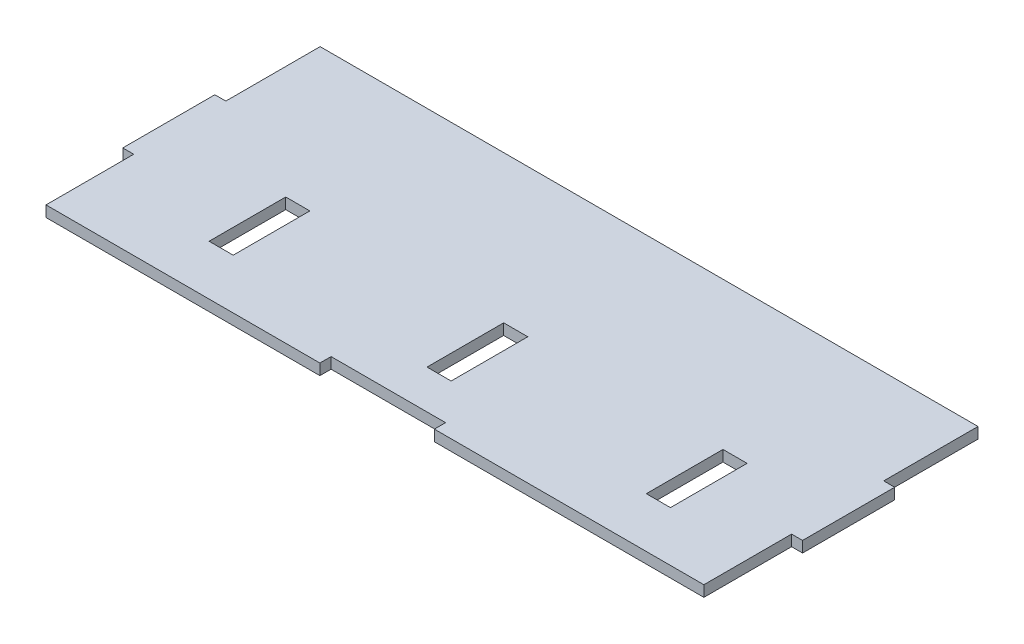
ISO-10303-21;
HEADER;
FILE_DESCRIPTION(('STEP AP214'),'2;1');
FILE_NAME('part.step','',(''),(''),'','','');
FILE_SCHEMA(('AUTOMOTIVE_DESIGN { 1 0 10303 214 1 1 1 1 }'));
ENDSEC;
DATA;
#1=APPLICATION_CONTEXT('core data for automotive mechanical design processes');
#2=APPLICATION_PROTOCOL_DEFINITION('international standard','automotive_design',2000,#1);
#3=PRODUCT_CONTEXT('',#1,'mechanical');
#4=PRODUCT('Part','Part','',(#3));
#5=PRODUCT_RELATED_PRODUCT_CATEGORY('part','',(#4));
#6=PRODUCT_DEFINITION_FORMATION('','',#4);
#7=PRODUCT_DEFINITION_CONTEXT('part definition',#1,'design');
#8=PRODUCT_DEFINITION('design','',#6,#7);
#9=PRODUCT_DEFINITION_SHAPE('','',#8);
#10=(LENGTH_UNIT() NAMED_UNIT(*) SI_UNIT(.MILLI.,.METRE.));
#11=(NAMED_UNIT(*) PLANE_ANGLE_UNIT() SI_UNIT($,.RADIAN.));
#12=(NAMED_UNIT(*) SI_UNIT($,.STERADIAN.) SOLID_ANGLE_UNIT());
#13=UNCERTAINTY_MEASURE_WITH_UNIT(LENGTH_MEASURE(1.E-05),#10,'distance_accuracy_value','');
#14=(GEOMETRIC_REPRESENTATION_CONTEXT(3) GLOBAL_UNCERTAINTY_ASSIGNED_CONTEXT((#13)) GLOBAL_UNIT_ASSIGNED_CONTEXT((#10,
#11,#12)) REPRESENTATION_CONTEXT('',''));
#15=CARTESIAN_POINT('',(0.,0.,0.));
#16=DIRECTION('',(0.,0.,1.));
#17=DIRECTION('',(1.,0.,0.));
#18=AXIS2_PLACEMENT_3D('',#15,#16,#17);
#19=CARTESIAN_POINT('',(0.,5.,125.));
#20=DIRECTION('',(0.,0.,-1.));
#21=DIRECTION('',(-1.,0.,0.));
#22=AXIS2_PLACEMENT_3D('',#19,#20,#21);
#23=PLANE('',#22);
#24=DIRECTION('',(1.,0.,0.));
#25=VECTOR('',#24,1.);
#26=CARTESIAN_POINT('',(0.,0.,125.));
#27=LINE('',#26,#25);
#28=CARTESIAN_POINT('',(-300.,0.,125.));
#29=VERTEX_POINT('',#28);
#30=CARTESIAN_POINT('',(-175.100000000002,0.,125.));
#31=VERTEX_POINT('',#30);
#32=EDGE_CURVE('E472',#29,#31,#27,.T.);
#33=ORIENTED_EDGE('',*,*,#32,.T.);
#34=DIRECTION('',(0.,1.,0.));
#35=VECTOR('',#34,1.);
#36=CARTESIAN_POINT('',(-175.100000000002,5.,125.));
#37=LINE('',#36,#35);
#38=CARTESIAN_POINT('',(-175.100000000002,5.,125.));
#39=VERTEX_POINT('',#38);
#40=EDGE_CURVE('E372',#31,#39,#37,.T.);
#41=ORIENTED_EDGE('',*,*,#40,.T.);
#42=DIRECTION('',(1.,0.,0.));
#43=VECTOR('',#42,1.);
#44=CARTESIAN_POINT('',(0.,5.,125.));
#45=LINE('',#44,#43);
#46=CARTESIAN_POINT('',(-300.,5.,125.));
#47=VERTEX_POINT('',#46);
#48=EDGE_CURVE('E459',#47,#39,#45,.T.);
#49=ORIENTED_EDGE('',*,*,#48,.F.);
#50=DIRECTION('',(0.,-1.,0.));
#51=VECTOR('',#50,1.);
#52=CARTESIAN_POINT('',(-300.,5.,125.));
#53=LINE('',#52,#51);
#54=EDGE_CURVE('E477',#47,#29,#53,.T.);
#55=ORIENTED_EDGE('',*,*,#54,.T.);
#56=EDGE_LOOP('',(#33,#41,#49,#55));
#57=FACE_BOUND('',#56,.T.);
#58=ADVANCED_FACE('F89',(#57),#23,.F.);
#59=CARTESIAN_POINT('',(0.,5.,0.));
#60=DIRECTION('',(-1.,0.,0.));
#61=DIRECTION('',(0.,0.,1.));
#62=AXIS2_PLACEMENT_3D('',#59,#60,#61);
#63=PLANE('',#62);
#64=CARTESIAN_POINT('',(0.,5.,85.));
#65=CARTESIAN_POINT('',(0.,0.,85.));
#66=B_SPLINE_CURVE_WITH_KNOTS('',1,(#64,#65),.UNSPECIFIED.,.F.,.F.,(2,2),(0.,
0.0531914893617021),.UNSPECIFIED.);
#67=CARTESIAN_POINT('',(0.,5.,85.));
#68=VERTEX_POINT('',#67);
#69=CARTESIAN_POINT('',(0.,0.,85.));
#70=VERTEX_POINT('',#69);
#71=EDGE_CURVE('E383',#68,#70,#66,.T.);
#72=ORIENTED_EDGE('',*,*,#71,.F.);
#73=DIRECTION('',(0.,0.,-1.));
#74=VECTOR('',#73,1.);
#75=CARTESIAN_POINT('',(0.,5.,0.));
#76=LINE('',#75,#74);
#77=CARTESIAN_POINT('',(0.,5.,125.));
#78=VERTEX_POINT('',#77);
#79=EDGE_CURVE('E448',#78,#68,#76,.T.);
#80=ORIENTED_EDGE('',*,*,#79,.F.);
#81=DIRECTION('',(0.,-1.,0.));
#82=VECTOR('',#81,1.);
#83=CARTESIAN_POINT('',(0.,5.,125.));
#84=LINE('',#83,#82);
#85=CARTESIAN_POINT('',(0.,0.,125.));
#86=VERTEX_POINT('',#85);
#87=EDGE_CURVE('E462',#78,#86,#84,.T.);
#88=ORIENTED_EDGE('',*,*,#87,.T.);
#89=DIRECTION('',(0.,0.,-1.));
#90=VECTOR('',#89,1.);
#91=CARTESIAN_POINT('',(0.,0.,0.));
#92=LINE('',#91,#90);
#93=EDGE_CURVE('E463',#86,#70,#92,.T.);
#94=ORIENTED_EDGE('',*,*,#93,.T.);
#95=EDGE_LOOP('',(#72,#80,#88,#94));
#96=FACE_BOUND('',#95,.T.);
#97=ADVANCED_FACE('F91',(#96),#63,.F.);
#98=CARTESIAN_POINT('',(0.,0.,43.));
#99=CARTESIAN_POINT('',(0.,5.,43.));
#100=B_SPLINE_CURVE_WITH_KNOTS('',1,(#98,#99),.UNSPECIFIED.,.F.,.F.,(2,2),(0.5,
0.553191489361702),.UNSPECIFIED.);
#101=CARTESIAN_POINT('',(0.,0.,43.));
#102=VERTEX_POINT('',#101);
#103=CARTESIAN_POINT('',(0.,5.,43.));
#104=VERTEX_POINT('',#103);
#105=EDGE_CURVE('E376',#102,#104,#100,.T.);
#106=ORIENTED_EDGE('',*,*,#105,.F.);
#107=CARTESIAN_POINT('',(0.,0.,0.));
#108=VERTEX_POINT('',#107);
#109=EDGE_CURVE('E447',#102,#108,#92,.T.);
#110=ORIENTED_EDGE('',*,*,#109,.T.);
#111=DIRECTION('',(0.,-1.,0.));
#112=VECTOR('',#111,1.);
#113=CARTESIAN_POINT('',(0.,5.,0.));
#114=LINE('',#113,#112);
#115=CARTESIAN_POINT('',(0.,5.,0.));
#116=VERTEX_POINT('',#115);
#117=EDGE_CURVE('E483',#116,#108,#114,.T.);
#118=ORIENTED_EDGE('',*,*,#117,.F.);
#119=EDGE_CURVE('E452',#104,#116,#76,.T.);
#120=ORIENTED_EDGE('',*,*,#119,.F.);
#121=EDGE_LOOP('',(#106,#110,#118,#120));
#122=FACE_BOUND('',#121,.T.);
#123=ADVANCED_FACE('F538',(#122),#63,.F.);
#124=CARTESIAN_POINT('',(-300.,5.,0.));
#125=DIRECTION('',(1.,0.,0.));
#126=DIRECTION('',(0.,0.,-1.));
#127=AXIS2_PLACEMENT_3D('',#124,#125,#126);
#128=PLANE('',#127);
#129=DIRECTION('',(0.,0.,1.));
#130=VECTOR('',#129,1.);
#131=CARTESIAN_POINT('',(-300.,5.,0.));
#132=LINE('',#131,#130);
#133=CARTESIAN_POINT('',(-300.,5.,85.));
#134=VERTEX_POINT('',#133);
#135=EDGE_CURVE('E454',#134,#47,#132,.T.);
#136=ORIENTED_EDGE('',*,*,#135,.F.);
#137=CARTESIAN_POINT('',(-300.,5.,85.));
#138=CARTESIAN_POINT('',(-300.,0.,85.));
#139=B_SPLINE_CURVE_WITH_KNOTS('',1,(#137,#138),.UNSPECIFIED.,.F.,.F.,(2,2),(0.,
0.0531914893617021),.UNSPECIFIED.);
#140=CARTESIAN_POINT('',(-300.,0.,85.));
#141=VERTEX_POINT('',#140);
#142=EDGE_CURVE('E398',#134,#141,#139,.T.);
#143=ORIENTED_EDGE('',*,*,#142,.T.);
#144=DIRECTION('',(0.,0.,1.));
#145=VECTOR('',#144,1.);
#146=CARTESIAN_POINT('',(-300.,0.,0.));
#147=LINE('',#146,#145);
#148=EDGE_CURVE('E467',#141,#29,#147,.T.);
#149=ORIENTED_EDGE('',*,*,#148,.T.);
#150=ORIENTED_EDGE('',*,*,#54,.F.);
#151=EDGE_LOOP('',(#136,#143,#149,#150));
#152=FACE_BOUND('',#151,.T.);
#153=ADVANCED_FACE('F552',(#152),#128,.F.);
#154=CARTESIAN_POINT('',(0.,5.,0.));
#155=DIRECTION('',(0.,0.,1.));
#156=DIRECTION('',(1.,0.,0.));
#157=AXIS2_PLACEMENT_3D('',#154,#155,#156);
#158=PLANE('',#157);
#159=DIRECTION('',(-1.,0.,0.));
#160=VECTOR('',#159,1.);
#161=CARTESIAN_POINT('',(0.,0.,0.));
#162=LINE('',#161,#160);
#163=CARTESIAN_POINT('',(-300.,0.,0.));
#164=VERTEX_POINT('',#163);
#165=EDGE_CURVE('E465',#108,#164,#162,.T.);
#166=ORIENTED_EDGE('',*,*,#165,.T.);
#167=DIRECTION('',(0.,-1.,0.));
#168=VECTOR('',#167,1.);
#169=CARTESIAN_POINT('',(-300.,5.,0.));
#170=LINE('',#169,#168);
#171=CARTESIAN_POINT('',(-300.,5.,0.));
#172=VERTEX_POINT('',#171);
#173=EDGE_CURVE('E480',#172,#164,#170,.T.);
#174=ORIENTED_EDGE('',*,*,#173,.F.);
#175=DIRECTION('',(-1.,0.,0.));
#176=VECTOR('',#175,1.);
#177=CARTESIAN_POINT('',(0.,5.,0.));
#178=LINE('',#177,#176);
#179=EDGE_CURVE('E451',#116,#172,#178,.T.);
#180=ORIENTED_EDGE('',*,*,#179,.F.);
#181=ORIENTED_EDGE('',*,*,#117,.T.);
#182=EDGE_LOOP('',(#166,#174,#180,#181));
#183=FACE_BOUND('',#182,.T.);
#184=ADVANCED_FACE('F550',(#183),#158,.F.);
#185=CARTESIAN_POINT('',(-300.,0.,43.));
#186=VERTEX_POINT('',#185);
#187=EDGE_CURVE('E468',#164,#186,#147,.T.);
#188=ORIENTED_EDGE('',*,*,#187,.T.);
#189=CARTESIAN_POINT('',(-300.,0.,43.));
#190=CARTESIAN_POINT('',(-300.,5.,43.));
#191=B_SPLINE_CURVE_WITH_KNOTS('',1,(#189,#190),.UNSPECIFIED.,.F.,.F.,(2,2),(0.5,
0.553191489361702),.UNSPECIFIED.);
#192=CARTESIAN_POINT('',(-300.,5.,43.));
#193=VERTEX_POINT('',#192);
#194=EDGE_CURVE('E428',#186,#193,#191,.T.);
#195=ORIENTED_EDGE('',*,*,#194,.T.);
#196=EDGE_CURVE('E455',#172,#193,#132,.T.);
#197=ORIENTED_EDGE('',*,*,#196,.F.);
#198=ORIENTED_EDGE('',*,*,#173,.T.);
#199=EDGE_LOOP('',(#188,#195,#197,#198));
#200=FACE_BOUND('',#199,.T.);
#201=ADVANCED_FACE('F543',(#200),#128,.F.);
#202=CARTESIAN_POINT('',(-122.900000000002,5.,125.));
#203=VERTEX_POINT('',#202);
#204=EDGE_CURVE('E458',#203,#78,#45,.T.);
#205=ORIENTED_EDGE('',*,*,#204,.F.);
#206=DIRECTION('',(0.,-1.,0.));
#207=VECTOR('',#206,1.);
#208=CARTESIAN_POINT('',(-122.900000000002,5.,125.));
#209=LINE('',#208,#207);
#210=CARTESIAN_POINT('',(-122.900000000002,0.,125.));
#211=VERTEX_POINT('',#210);
#212=EDGE_CURVE('E369',#203,#211,#209,.T.);
#213=ORIENTED_EDGE('',*,*,#212,.T.);
#214=EDGE_CURVE('E471',#211,#86,#27,.T.);
#215=ORIENTED_EDGE('',*,*,#214,.T.);
#216=ORIENTED_EDGE('',*,*,#87,.F.);
#217=EDGE_LOOP('',(#205,#213,#215,#216));
#218=FACE_BOUND('',#217,.T.);
#219=ADVANCED_FACE('F534',(#218),#23,.F.);
#220=CARTESIAN_POINT('',(0.,5.,0.));
#221=DIRECTION('',(0.,-1.,0.));
#222=DIRECTION('',(0.,0.,-1.));
#223=AXIS2_PLACEMENT_3D('',#220,#221,#222);
#224=PLANE('',#223);
#225=DIRECTION('',(1.,0.,0.));
#226=VECTOR('',#225,1.);
#227=CARTESIAN_POINT('',(-248.46073622698,5.,102.17880564705));
#228=LINE('',#227,#226);
#229=CARTESIAN_POINT('',(-248.46073622698,5.,102.17880564705));
#230=VERTEX_POINT('',#229);
#231=CARTESIAN_POINT('',(-237.46073622698,5.,102.17880564705));
#232=VERTEX_POINT('',#231);
#233=EDGE_CURVE('E290',#230,#232,#228,.T.);
#234=ORIENTED_EDGE('',*,*,#233,.F.);
#235=DIRECTION('',(0.,0.,1.));
#236=VECTOR('',#235,1.);
#237=CARTESIAN_POINT('',(-248.46073622698,5.,67.2204334123074));
#238=LINE('',#237,#236);
#239=CARTESIAN_POINT('',(-248.46073622698,5.,67.2204334123074));
#240=VERTEX_POINT('',#239);
#241=EDGE_CURVE('E104',#240,#230,#238,.T.);
#242=ORIENTED_EDGE('',*,*,#241,.F.);
#243=DIRECTION('',(-1.,0.,0.));
#244=VECTOR('',#243,1.);
#245=CARTESIAN_POINT('',(-248.46073622698,5.,67.2204334123074));
#246=LINE('',#245,#244);
#247=CARTESIAN_POINT('',(-237.46073622698,5.,67.2204334123074));
#248=VERTEX_POINT('',#247);
#249=EDGE_CURVE('E297',#248,#240,#246,.T.);
#250=ORIENTED_EDGE('',*,*,#249,.F.);
#251=DIRECTION('',(0.,0.,-1.));
#252=VECTOR('',#251,1.);
#253=CARTESIAN_POINT('',(-237.46073622698,5.,67.2204334123074));
#254=LINE('',#253,#252);
#255=EDGE_CURVE('E280',#232,#248,#254,.T.);
#256=ORIENTED_EDGE('',*,*,#255,.F.);
#257=EDGE_LOOP('',(#234,#242,#250,#256));
#258=FACE_BOUND('',#257,.T.);
#259=DIRECTION('',(1.,0.,0.));
#260=VECTOR('',#259,1.);
#261=CARTESIAN_POINT('',(-149.075874615827,5.,102.17880564705));
#262=LINE('',#261,#260);
#263=CARTESIAN_POINT('',(-149.075874615827,5.,102.17880564705));
#264=VERTEX_POINT('',#263);
#265=CARTESIAN_POINT('',(-138.075874615827,5.,102.17880564705));
#266=VERTEX_POINT('',#265);
#267=EDGE_CURVE('E308',#264,#266,#262,.T.);
#268=ORIENTED_EDGE('',*,*,#267,.F.);
#269=DIRECTION('',(0.,0.,1.));
#270=VECTOR('',#269,1.);
#271=CARTESIAN_POINT('',(-149.075874615827,5.,67.2204334123074));
#272=LINE('',#271,#270);
#273=CARTESIAN_POINT('',(-149.075874615827,5.,67.2204334123074));
#274=VERTEX_POINT('',#273);
#275=EDGE_CURVE('E112',#274,#264,#272,.T.);
#276=ORIENTED_EDGE('',*,*,#275,.F.);
#277=DIRECTION('',(-1.,0.,0.));
#278=VECTOR('',#277,1.);
#279=CARTESIAN_POINT('',(-149.075874615827,5.,67.2204334123074));
#280=LINE('',#279,#278);
#281=CARTESIAN_POINT('',(-138.075874615827,5.,67.2204334123074));
#282=VERTEX_POINT('',#281);
#283=EDGE_CURVE('E315',#282,#274,#280,.T.);
#284=ORIENTED_EDGE('',*,*,#283,.F.);
#285=DIRECTION('',(0.,0.,-1.));
#286=VECTOR('',#285,1.);
#287=CARTESIAN_POINT('',(-138.075874615827,5.,67.2204334123074));
#288=LINE('',#287,#286);
#289=EDGE_CURVE('E312',#266,#282,#288,.T.);
#290=ORIENTED_EDGE('',*,*,#289,.F.);
#291=EDGE_LOOP('',(#268,#276,#284,#290));
#292=FACE_BOUND('',#291,.T.);
#293=DIRECTION('',(1.,0.,0.));
#294=VECTOR('',#293,1.);
#295=CARTESIAN_POINT('',(-49.0758746158267,5.,102.17880564705));
#296=LINE('',#295,#294);
#297=CARTESIAN_POINT('',(-49.0758746158267,5.,102.17880564705));
#298=VERTEX_POINT('',#297);
#299=CARTESIAN_POINT('',(-38.0758746158267,5.,102.17880564705));
#300=VERTEX_POINT('',#299);
#301=EDGE_CURVE('E328',#298,#300,#296,.T.);
#302=ORIENTED_EDGE('',*,*,#301,.F.);
#303=DIRECTION('',(0.,0.,1.));
#304=VECTOR('',#303,1.);
#305=CARTESIAN_POINT('',(-49.0758746158267,5.,67.2204334123074));
#306=LINE('',#305,#304);
#307=CARTESIAN_POINT('',(-49.0758746158267,5.,67.2204334123074));
#308=VERTEX_POINT('',#307);
#309=EDGE_CURVE('E326',#308,#298,#306,.T.);
#310=ORIENTED_EDGE('',*,*,#309,.F.);
#311=DIRECTION('',(-1.,0.,0.));
#312=VECTOR('',#311,1.);
#313=CARTESIAN_POINT('',(-49.0758746158267,5.,67.2204334123074));
#314=LINE('',#313,#312);
#315=CARTESIAN_POINT('',(-38.0758746158267,5.,67.2204334123074));
#316=VERTEX_POINT('',#315);
#317=EDGE_CURVE('E334',#316,#308,#314,.T.);
#318=ORIENTED_EDGE('',*,*,#317,.F.);
#319=DIRECTION('',(0.,0.,-1.));
#320=VECTOR('',#319,1.);
#321=CARTESIAN_POINT('',(-38.0758746158267,5.,67.2204334123074));
#322=LINE('',#321,#320);
#323=EDGE_CURVE('E331',#300,#316,#322,.T.);
#324=ORIENTED_EDGE('',*,*,#323,.F.);
#325=EDGE_LOOP('',(#302,#310,#318,#324));
#326=FACE_BOUND('',#325,.T.);
#327=ORIENTED_EDGE('',*,*,#48,.T.);
#328=DIRECTION('',(0.,0.,1.));
#329=VECTOR('',#328,1.);
#330=CARTESIAN_POINT('',(-175.100000000002,5.,125.1));
#331=LINE('',#330,#329);
#332=CARTESIAN_POINT('',(-175.100000000002,5.,119.9));
#333=VERTEX_POINT('',#332);
#334=EDGE_CURVE('E347',#333,#39,#331,.T.);
#335=ORIENTED_EDGE('',*,*,#334,.F.);
#336=DIRECTION('',(-1.,0.,0.));
#337=VECTOR('',#336,1.);
#338=CARTESIAN_POINT('',(-175.100000000002,5.,119.9));
#339=LINE('',#338,#337);
#340=CARTESIAN_POINT('',(-122.900000000002,5.,119.9));
#341=VERTEX_POINT('',#340);
#342=EDGE_CURVE('E350',#341,#333,#339,.T.);
#343=ORIENTED_EDGE('',*,*,#342,.F.);
#344=DIRECTION('',(0.,0.,-1.));
#345=VECTOR('',#344,1.);
#346=CARTESIAN_POINT('',(-122.900000000002,5.,119.9));
#347=LINE('',#346,#345);
#348=EDGE_CURVE('E345',#203,#341,#347,.T.);
#349=ORIENTED_EDGE('',*,*,#348,.F.);
#350=ORIENTED_EDGE('',*,*,#204,.T.);
#351=ORIENTED_EDGE('',*,*,#79,.T.);
#352=DIRECTION('',(-1.,0.,0.));
#353=VECTOR('',#352,1.);
#354=CARTESIAN_POINT('',(9.99999999954931,5.,85.));
#355=LINE('',#354,#353);
#356=CARTESIAN_POINT('',(5.00000000000019,5.,85.));
#357=VERTEX_POINT('',#356);
#358=EDGE_CURVE('E375',#357,#68,#355,.T.);
#359=ORIENTED_EDGE('',*,*,#358,.F.);
#360=DIRECTION('',(0.,0.,1.));
#361=VECTOR('',#360,1.);
#362=CARTESIAN_POINT('',(5.00000000000033,5.,43.));
#363=LINE('',#362,#361);
#364=CARTESIAN_POINT('',(5.00000000000026,5.,43.));
#365=VERTEX_POINT('',#364);
#366=EDGE_CURVE('E405',#365,#357,#363,.T.);
#367=ORIENTED_EDGE('',*,*,#366,.F.);
#368=DIRECTION('',(-1.,0.,0.));
#369=VECTOR('',#368,1.);
#370=CARTESIAN_POINT('',(9.99999999954931,5.,43.));
#371=LINE('',#370,#369);
#372=EDGE_CURVE('E381',#365,#104,#371,.T.);
#373=ORIENTED_EDGE('',*,*,#372,.T.);
#374=ORIENTED_EDGE('',*,*,#119,.T.);
#375=ORIENTED_EDGE('',*,*,#179,.T.);
#376=ORIENTED_EDGE('',*,*,#196,.T.);
#377=DIRECTION('',(1.,0.,0.));
#378=VECTOR('',#377,1.);
#379=CARTESIAN_POINT('',(-309.999999999998,5.,43.));
#380=LINE('',#379,#378);
#381=CARTESIAN_POINT('',(-304.999999999999,5.,43.));
#382=VERTEX_POINT('',#381);
#383=EDGE_CURVE('E441',#382,#193,#380,.T.);
#384=ORIENTED_EDGE('',*,*,#383,.F.);
#385=DIRECTION('',(0.,0.,-1.));
#386=VECTOR('',#385,1.);
#387=CARTESIAN_POINT('',(-304.999999999999,5.,43.));
#388=LINE('',#387,#386);
#389=CARTESIAN_POINT('',(-304.999999999999,5.,85.));
#390=VERTEX_POINT('',#389);
#391=EDGE_CURVE('E418',#390,#382,#388,.T.);
#392=ORIENTED_EDGE('',*,*,#391,.F.);
#393=DIRECTION('',(1.,0.,0.));
#394=VECTOR('',#393,1.);
#395=CARTESIAN_POINT('',(-309.999999999998,5.,85.));
#396=LINE('',#395,#394);
#397=EDGE_CURVE('E419',#390,#134,#396,.T.);
#398=ORIENTED_EDGE('',*,*,#397,.T.);
#399=ORIENTED_EDGE('',*,*,#135,.T.);
#400=EDGE_LOOP('',(#327,#335,#343,#349,#350,#351,#359,#367,#373,#374,#375,#376,#384,#392,#398,#399));
#401=FACE_BOUND('',#400,.T.);
#402=ADVANCED_FACE('F294',(#258,#292,#326,#401),#224,.F.);
#403=CARTESIAN_POINT('',(0.,0.,0.));
#404=DIRECTION('',(0.,-1.,0.));
#405=DIRECTION('',(0.,0.,-1.));
#406=AXIS2_PLACEMENT_3D('',#403,#404,#405);
#407=PLANE('',#406);
#408=DIRECTION('',(0.,0.,-1.));
#409=VECTOR('',#408,1.);
#410=CARTESIAN_POINT('',(-248.46073622698,0.,0.));
#411=LINE('',#410,#409);
#412=CARTESIAN_POINT('',(-248.46073622698,0.,102.17880564705));
#413=VERTEX_POINT('',#412);
#414=CARTESIAN_POINT('',(-248.46073622698,0.,67.2204334123074));
#415=VERTEX_POINT('',#414);
#416=EDGE_CURVE('E13',#413,#415,#411,.T.);
#417=ORIENTED_EDGE('',*,*,#416,.F.);
#418=DIRECTION('',(-1.,0.,0.));
#419=VECTOR('',#418,1.);
#420=CARTESIAN_POINT('',(0.,0.,102.17880564705));
#421=LINE('',#420,#419);
#422=CARTESIAN_POINT('',(-237.46073622698,0.,102.17880564705));
#423=VERTEX_POINT('',#422);
#424=EDGE_CURVE('E507',#423,#413,#421,.T.);
#425=ORIENTED_EDGE('',*,*,#424,.F.);
#426=DIRECTION('',(0.,0.,1.));
#427=VECTOR('',#426,1.);
#428=CARTESIAN_POINT('',(-237.46073622698,0.,0.));
#429=LINE('',#428,#427);
#430=CARTESIAN_POINT('',(-237.46073622698,0.,67.2204334123074));
#431=VERTEX_POINT('',#430);
#432=EDGE_CURVE('E283',#431,#423,#429,.T.);
#433=ORIENTED_EDGE('',*,*,#432,.F.);
#434=DIRECTION('',(1.,0.,0.));
#435=VECTOR('',#434,1.);
#436=CARTESIAN_POINT('',(0.,0.,67.2204334123074));
#437=LINE('',#436,#435);
#438=EDGE_CURVE('E97',#415,#431,#437,.T.);
#439=ORIENTED_EDGE('',*,*,#438,.F.);
#440=EDGE_LOOP('',(#417,#425,#433,#439));
#441=FACE_BOUND('',#440,.T.);
#442=DIRECTION('',(0.,0.,-1.));
#443=VECTOR('',#442,1.);
#444=CARTESIAN_POINT('',(-149.075874615827,0.,0.));
#445=LINE('',#444,#443);
#446=CARTESIAN_POINT('',(-149.075874615827,0.,102.17880564705));
#447=VERTEX_POINT('',#446);
#448=CARTESIAN_POINT('',(-149.075874615827,0.,67.2204334123074));
#449=VERTEX_POINT('',#448);
#450=EDGE_CURVE('E505',#447,#449,#445,.T.);
#451=ORIENTED_EDGE('',*,*,#450,.F.);
#452=DIRECTION('',(-1.,0.,0.));
#453=VECTOR('',#452,1.);
#454=CARTESIAN_POINT('',(0.,0.,102.17880564705));
#455=LINE('',#454,#453);
#456=CARTESIAN_POINT('',(-138.075874615827,0.,102.17880564705));
#457=VERTEX_POINT('',#456);
#458=EDGE_CURVE('E498',#457,#447,#455,.T.);
#459=ORIENTED_EDGE('',*,*,#458,.F.);
#460=DIRECTION('',(0.,0.,1.));
#461=VECTOR('',#460,1.);
#462=CARTESIAN_POINT('',(-138.075874615827,0.,0.));
#463=LINE('',#462,#461);
#464=CARTESIAN_POINT('',(-138.075874615827,0.,67.2204334123074));
#465=VERTEX_POINT('',#464);
#466=EDGE_CURVE('E500',#465,#457,#463,.T.);
#467=ORIENTED_EDGE('',*,*,#466,.F.);
#468=DIRECTION('',(1.,0.,0.));
#469=VECTOR('',#468,1.);
#470=CARTESIAN_POINT('',(0.,0.,67.2204334123074));
#471=LINE('',#470,#469);
#472=EDGE_CURVE('E503',#449,#465,#471,.T.);
#473=ORIENTED_EDGE('',*,*,#472,.F.);
#474=EDGE_LOOP('',(#451,#459,#467,#473));
#475=FACE_BOUND('',#474,.T.);
#476=DIRECTION('',(0.,0.,-1.));
#477=VECTOR('',#476,1.);
#478=CARTESIAN_POINT('',(-49.0758746158267,0.,0.));
#479=LINE('',#478,#477);
#480=CARTESIAN_POINT('',(-49.0758746158267,0.,102.17880564705));
#481=VERTEX_POINT('',#480);
#482=CARTESIAN_POINT('',(-49.0758746158267,0.,67.2204334123074));
#483=VERTEX_POINT('',#482);
#484=EDGE_CURVE('E496',#481,#483,#479,.T.);
#485=ORIENTED_EDGE('',*,*,#484,.F.);
#486=DIRECTION('',(-1.,0.,0.));
#487=VECTOR('',#486,1.);
#488=CARTESIAN_POINT('',(0.,0.,102.17880564705));
#489=LINE('',#488,#487);
#490=CARTESIAN_POINT('',(-38.0758746158267,0.,102.17880564705));
#491=VERTEX_POINT('',#490);
#492=EDGE_CURVE('E489',#491,#481,#489,.T.);
#493=ORIENTED_EDGE('',*,*,#492,.F.);
#494=DIRECTION('',(0.,0.,1.));
#495=VECTOR('',#494,1.);
#496=CARTESIAN_POINT('',(-38.0758746158267,0.,0.));
#497=LINE('',#496,#495);
#498=CARTESIAN_POINT('',(-38.0758746158267,0.,67.2204334123074));
#499=VERTEX_POINT('',#498);
#500=EDGE_CURVE('E491',#499,#491,#497,.T.);
#501=ORIENTED_EDGE('',*,*,#500,.F.);
#502=DIRECTION('',(1.,0.,0.));
#503=VECTOR('',#502,1.);
#504=CARTESIAN_POINT('',(0.,0.,67.2204334123074));
#505=LINE('',#504,#503);
#506=EDGE_CURVE('E494',#483,#499,#505,.T.);
#507=ORIENTED_EDGE('',*,*,#506,.F.);
#508=EDGE_LOOP('',(#485,#493,#501,#507));
#509=FACE_BOUND('',#508,.T.);
#510=DIRECTION('',(0.,0.,-1.));
#511=VECTOR('',#510,1.);
#512=CARTESIAN_POINT('',(-175.100000000002,0.,0.));
#513=LINE('',#512,#511);
#514=CARTESIAN_POINT('',(-175.100000000002,0.,119.9));
#515=VERTEX_POINT('',#514);
#516=EDGE_CURVE('E486',#31,#515,#513,.T.);
#517=ORIENTED_EDGE('',*,*,#516,.F.);
#518=ORIENTED_EDGE('',*,*,#32,.F.);
#519=ORIENTED_EDGE('',*,*,#148,.F.);
#520=DIRECTION('',(1.,0.,0.));
#521=VECTOR('',#520,1.);
#522=CARTESIAN_POINT('',(-309.999999999998,0.,85.));
#523=LINE('',#522,#521);
#524=CARTESIAN_POINT('',(-304.999999999999,0.,85.));
#525=VERTEX_POINT('',#524);
#526=EDGE_CURVE('E436',#525,#141,#523,.T.);
#527=ORIENTED_EDGE('',*,*,#526,.F.);
#528=DIRECTION('',(0.,0.,1.));
#529=VECTOR('',#528,1.);
#530=CARTESIAN_POINT('',(-304.999999999999,0.,85.));
#531=LINE('',#530,#529);
#532=CARTESIAN_POINT('',(-304.999999999999,0.,43.));
#533=VERTEX_POINT('',#532);
#534=EDGE_CURVE('E423',#533,#525,#531,.T.);
#535=ORIENTED_EDGE('',*,*,#534,.F.);
#536=DIRECTION('',(1.,0.,0.));
#537=VECTOR('',#536,1.);
#538=CARTESIAN_POINT('',(-309.999999999998,0.,43.));
#539=LINE('',#538,#537);
#540=EDGE_CURVE('E443',#533,#186,#539,.T.);
#541=ORIENTED_EDGE('',*,*,#540,.T.);
#542=ORIENTED_EDGE('',*,*,#187,.F.);
#543=ORIENTED_EDGE('',*,*,#165,.F.);
#544=ORIENTED_EDGE('',*,*,#109,.F.);
#545=DIRECTION('',(-1.,0.,0.));
#546=VECTOR('',#545,1.);
#547=CARTESIAN_POINT('',(9.99999999954931,0.,43.));
#548=LINE('',#547,#546);
#549=CARTESIAN_POINT('',(5.00000000000033,0.,43.));
#550=VERTEX_POINT('',#549);
#551=EDGE_CURVE('E382',#550,#102,#548,.T.);
#552=ORIENTED_EDGE('',*,*,#551,.F.);
#553=DIRECTION('',(0.,0.,-1.));
#554=VECTOR('',#553,1.);
#555=CARTESIAN_POINT('',(5.00000000000019,0.,85.));
#556=LINE('',#555,#554);
#557=CARTESIAN_POINT('',(5.00000000000026,0.,85.));
#558=VERTEX_POINT('',#557);
#559=EDGE_CURVE('E399',#558,#550,#556,.T.);
#560=ORIENTED_EDGE('',*,*,#559,.F.);
#561=DIRECTION('',(-1.,0.,0.));
#562=VECTOR('',#561,1.);
#563=CARTESIAN_POINT('',(9.99999999954931,0.,85.));
#564=LINE('',#563,#562);
#565=EDGE_CURVE('E391',#558,#70,#564,.T.);
#566=ORIENTED_EDGE('',*,*,#565,.T.);
#567=ORIENTED_EDGE('',*,*,#93,.F.);
#568=ORIENTED_EDGE('',*,*,#214,.F.);
#569=CARTESIAN_POINT('',(-122.900000000002,0.,119.9));
#570=CARTESIAN_POINT('',(-122.900000000002,0.,125.1));
#571=B_SPLINE_CURVE_WITH_KNOTS('',1,(#569,#570),.UNSPECIFIED.,.F.,.F.,(2,2),(0.5,
0.545296167247387),.UNSPECIFIED.);
#572=CARTESIAN_POINT('',(-122.900000000002,0.,119.9));
#573=VERTEX_POINT('',#572);
#574=EDGE_CURVE('E355',#573,#211,#571,.T.);
#575=ORIENTED_EDGE('',*,*,#574,.F.);
#576=CARTESIAN_POINT('',(-175.100000000002,0.,119.9));
#577=CARTESIAN_POINT('',(-122.900000000002,0.,119.9));
#578=B_SPLINE_CURVE_WITH_KNOTS('',1,(#576,#577),.UNSPECIFIED.,.F.,.F.,(2,2),(0.0452961672473868,
0.5),.UNSPECIFIED.);
#579=EDGE_CURVE('E304',#515,#573,#578,.T.);
#580=ORIENTED_EDGE('',*,*,#579,.F.);
#581=EDGE_LOOP('',(#517,#518,#519,#527,#535,#541,#542,#543,#544,#552,#560,#566,#567,#568,#575,#580));
#582=FACE_BOUND('',#581,.T.);
#583=ADVANCED_FACE('F515',(#441,#475,#509,#582),#407,.T.);
#584=CARTESIAN_POINT('',(-309.999999999998,5.,85.));
#585=DIRECTION('',(0.,0.,1.));
#586=DIRECTION('',(1.,0.,0.));
#587=AXIS2_PLACEMENT_3D('',#584,#585,#586);
#588=PLANE('',#587);
#589=DIRECTION('',(0.,1.,0.));
#590=VECTOR('',#589,1.);
#591=CARTESIAN_POINT('',(-304.999999999999,5.,85.));
#592=LINE('',#591,#590);
#593=EDGE_CURVE('E421',#525,#390,#592,.T.);
#594=ORIENTED_EDGE('',*,*,#593,.F.);
#595=ORIENTED_EDGE('',*,*,#526,.T.);
#596=ORIENTED_EDGE('',*,*,#142,.F.);
#597=ORIENTED_EDGE('',*,*,#397,.F.);
#598=EDGE_LOOP('',(#594,#595,#596,#597));
#599=FACE_BOUND('',#598,.T.);
#600=ADVANCED_FACE('F605',(#599),#588,.T.);
#601=CARTESIAN_POINT('',(-309.999999999998,0.,43.));
#602=DIRECTION('',(0.,0.,-1.));
#603=DIRECTION('',(-1.,0.,0.));
#604=AXIS2_PLACEMENT_3D('',#601,#602,#603);
#605=PLANE('',#604);
#606=DIRECTION('',(0.,-1.,0.));
#607=VECTOR('',#606,1.);
#608=CARTESIAN_POINT('',(-304.999999999999,0.,43.));
#609=LINE('',#608,#607);
#610=EDGE_CURVE('E416',#382,#533,#609,.T.);
#611=ORIENTED_EDGE('',*,*,#610,.F.);
#612=ORIENTED_EDGE('',*,*,#383,.T.);
#613=ORIENTED_EDGE('',*,*,#194,.F.);
#614=ORIENTED_EDGE('',*,*,#540,.F.);
#615=EDGE_LOOP('',(#611,#612,#613,#614));
#616=FACE_BOUND('',#615,.T.);
#617=ADVANCED_FACE('F597',(#616),#605,.T.);
#618=CARTESIAN_POINT('',(-304.999999999999,244.999999999996,-24.999999999996));
#619=DIRECTION('',(1.,0.,0.));
#620=DIRECTION('',(0.,0.,-1.));
#621=AXIS2_PLACEMENT_3D('',#618,#619,#620);
#622=PLANE('',#621);
#623=ORIENTED_EDGE('',*,*,#593,.T.);
#624=ORIENTED_EDGE('',*,*,#391,.T.);
#625=ORIENTED_EDGE('',*,*,#610,.T.);
#626=ORIENTED_EDGE('',*,*,#534,.T.);
#627=EDGE_LOOP('',(#623,#624,#625,#626));
#628=FACE_BOUND('',#627,.T.);
#629=ADVANCED_FACE('F601',(#628),#622,.F.);
#630=CARTESIAN_POINT('',(9.99999999954931,5.,85.));
#631=DIRECTION('',(0.,0.,-1.));
#632=DIRECTION('',(-1.,0.,0.));
#633=AXIS2_PLACEMENT_3D('',#630,#631,#632);
#634=PLANE('',#633);
#635=DIRECTION('',(0.,-1.,0.));
#636=VECTOR('',#635,1.);
#637=CARTESIAN_POINT('',(5.00000000000019,5.,85.));
#638=LINE('',#637,#636);
#639=EDGE_CURVE('E402',#357,#558,#638,.T.);
#640=ORIENTED_EDGE('',*,*,#639,.F.);
#641=ORIENTED_EDGE('',*,*,#358,.T.);
#642=ORIENTED_EDGE('',*,*,#71,.T.);
#643=ORIENTED_EDGE('',*,*,#565,.F.);
#644=EDGE_LOOP('',(#640,#641,#642,#643));
#645=FACE_BOUND('',#644,.T.);
#646=ADVANCED_FACE('F575',(#645),#634,.F.);
#647=CARTESIAN_POINT('',(9.99999999954931,0.,43.));
#648=DIRECTION('',(0.,0.,1.));
#649=DIRECTION('',(1.,0.,0.));
#650=AXIS2_PLACEMENT_3D('',#647,#648,#649);
#651=PLANE('',#650);
#652=DIRECTION('',(0.,1.,0.));
#653=VECTOR('',#652,1.);
#654=CARTESIAN_POINT('',(5.00000000000033,0.,43.));
#655=LINE('',#654,#653);
#656=EDGE_CURVE('E392',#550,#365,#655,.T.);
#657=ORIENTED_EDGE('',*,*,#656,.F.);
#658=ORIENTED_EDGE('',*,*,#551,.T.);
#659=ORIENTED_EDGE('',*,*,#105,.T.);
#660=ORIENTED_EDGE('',*,*,#372,.F.);
#661=EDGE_LOOP('',(#657,#658,#659,#660));
#662=FACE_BOUND('',#661,.T.);
#663=ADVANCED_FACE('F581',(#662),#651,.F.);
#664=CARTESIAN_POINT('',(5.00000000000056,244.999999999996,-24.9999999999962));
#665=DIRECTION('',(1.,0.,0.));
#666=DIRECTION('',(0.,0.,-1.));
#667=AXIS2_PLACEMENT_3D('',#664,#665,#666);
#668=PLANE('',#667);
#669=ORIENTED_EDGE('',*,*,#366,.T.);
#670=ORIENTED_EDGE('',*,*,#639,.T.);
#671=ORIENTED_EDGE('',*,*,#559,.T.);
#672=ORIENTED_EDGE('',*,*,#656,.T.);
#673=EDGE_LOOP('',(#669,#670,#671,#672));
#674=FACE_BOUND('',#673,.T.);
#675=ADVANCED_FACE('F578',(#674),#668,.T.);
#676=CARTESIAN_POINT('',(-175.100000000002,10.,125.1));
#677=DIRECTION('',(-1.,0.,0.));
#678=DIRECTION('',(0.,0.,1.));
#679=AXIS2_PLACEMENT_3D('',#676,#677,#678);
#680=PLANE('',#679);
#681=ORIENTED_EDGE('',*,*,#516,.T.);
#682=DIRECTION('',(0.,-1.,0.));
#683=VECTOR('',#682,1.);
#684=CARTESIAN_POINT('',(-175.100000000002,10.,119.9));
#685=LINE('',#684,#683);
#686=EDGE_CURVE('E362',#333,#515,#685,.T.);
#687=ORIENTED_EDGE('',*,*,#686,.F.);
#688=ORIENTED_EDGE('',*,*,#334,.T.);
#689=ORIENTED_EDGE('',*,*,#40,.F.);
#690=EDGE_LOOP('',(#681,#687,#688,#689));
#691=FACE_BOUND('',#690,.T.);
#692=ADVANCED_FACE('F614',(#691),#680,.F.);
#693=CARTESIAN_POINT('',(-122.900000000002,10.,119.9));
#694=DIRECTION('',(1.,0.,0.));
#695=DIRECTION('',(0.,0.,-1.));
#696=AXIS2_PLACEMENT_3D('',#693,#694,#695);
#697=PLANE('',#696);
#698=ORIENTED_EDGE('',*,*,#348,.T.);
#699=DIRECTION('',(0.,-1.,0.));
#700=VECTOR('',#699,1.);
#701=CARTESIAN_POINT('',(-122.900000000002,10.,119.9));
#702=LINE('',#701,#700);
#703=EDGE_CURVE('E348',#341,#573,#702,.T.);
#704=ORIENTED_EDGE('',*,*,#703,.T.);
#705=ORIENTED_EDGE('',*,*,#574,.T.);
#706=ORIENTED_EDGE('',*,*,#212,.F.);
#707=EDGE_LOOP('',(#698,#704,#705,#706));
#708=FACE_BOUND('',#707,.T.);
#709=ADVANCED_FACE('F563',(#708),#697,.F.);
#710=CARTESIAN_POINT('',(-175.100000000002,10.,119.9));
#711=DIRECTION('',(0.,0.,-1.));
#712=DIRECTION('',(-1.,0.,0.));
#713=AXIS2_PLACEMENT_3D('',#710,#711,#712);
#714=PLANE('',#713);
#715=ORIENTED_EDGE('',*,*,#342,.T.);
#716=ORIENTED_EDGE('',*,*,#686,.T.);
#717=ORIENTED_EDGE('',*,*,#579,.T.);
#718=ORIENTED_EDGE('',*,*,#703,.F.);
#719=EDGE_LOOP('',(#715,#716,#717,#718));
#720=FACE_BOUND('',#719,.T.);
#721=ADVANCED_FACE('F565',(#720),#714,.F.);
#722=CARTESIAN_POINT('',(-49.0758746158267,-5.,67.2204334123074));
#723=DIRECTION('',(-1.,0.,0.));
#724=DIRECTION('',(0.,0.,1.));
#725=AXIS2_PLACEMENT_3D('',#722,#723,#724);
#726=PLANE('',#725);
#727=ORIENTED_EDGE('',*,*,#484,.T.);
#728=DIRECTION('',(0.,1.,0.));
#729=VECTOR('',#728,1.);
#730=CARTESIAN_POINT('',(-49.0758746158267,-5.,67.2204334123074));
#731=LINE('',#730,#729);
#732=EDGE_CURVE('E309',#483,#308,#731,.T.);
#733=ORIENTED_EDGE('',*,*,#732,.T.);
#734=ORIENTED_EDGE('',*,*,#309,.T.);
#735=DIRECTION('',(0.,1.,0.));
#736=VECTOR('',#735,1.);
#737=CARTESIAN_POINT('',(-49.0758746158267,-5.,102.17880564705));
#738=LINE('',#737,#736);
#739=EDGE_CURVE('E337',#481,#298,#738,.T.);
#740=ORIENTED_EDGE('',*,*,#739,.F.);
#741=EDGE_LOOP('',(#727,#733,#734,#740));
#742=FACE_BOUND('',#741,.T.);
#743=ADVANCED_FACE('F696',(#742),#726,.F.);
#744=CARTESIAN_POINT('',(-49.0758746158267,-5.,67.2204334123074));
#745=DIRECTION('',(0.,0.,-1.));
#746=DIRECTION('',(-1.,0.,0.));
#747=AXIS2_PLACEMENT_3D('',#744,#745,#746);
#748=PLANE('',#747);
#749=ORIENTED_EDGE('',*,*,#506,.T.);
#750=DIRECTION('',(0.,1.,0.));
#751=VECTOR('',#750,1.);
#752=CARTESIAN_POINT('',(-38.0758746158267,-5.,67.2204334123074));
#753=LINE('',#752,#751);
#754=EDGE_CURVE('E339',#499,#316,#753,.T.);
#755=ORIENTED_EDGE('',*,*,#754,.T.);
#756=ORIENTED_EDGE('',*,*,#317,.T.);
#757=ORIENTED_EDGE('',*,*,#732,.F.);
#758=EDGE_LOOP('',(#749,#755,#756,#757));
#759=FACE_BOUND('',#758,.T.);
#760=ADVANCED_FACE('F773',(#759),#748,.F.);
#761=CARTESIAN_POINT('',(-38.0758746158267,-5.,67.2204334123074));
#762=DIRECTION('',(1.,0.,0.));
#763=DIRECTION('',(0.,0.,-1.));
#764=AXIS2_PLACEMENT_3D('',#761,#762,#763);
#765=PLANE('',#764);
#766=ORIENTED_EDGE('',*,*,#500,.T.);
#767=DIRECTION('',(0.,1.,0.));
#768=VECTOR('',#767,1.);
#769=CARTESIAN_POINT('',(-38.0758746158267,-5.,102.17880564705));
#770=LINE('',#769,#768);
#771=EDGE_CURVE('E341',#491,#300,#770,.T.);
#772=ORIENTED_EDGE('',*,*,#771,.T.);
#773=ORIENTED_EDGE('',*,*,#323,.T.);
#774=ORIENTED_EDGE('',*,*,#754,.F.);
#775=EDGE_LOOP('',(#766,#772,#773,#774));
#776=FACE_BOUND('',#775,.T.);
#777=ADVANCED_FACE('F780',(#776),#765,.F.);
#778=CARTESIAN_POINT('',(-49.0758746158267,-5.,102.17880564705));
#779=DIRECTION('',(0.,0.,1.));
#780=DIRECTION('',(1.,0.,0.));
#781=AXIS2_PLACEMENT_3D('',#778,#779,#780);
#782=PLANE('',#781);
#783=ORIENTED_EDGE('',*,*,#492,.T.);
#784=ORIENTED_EDGE('',*,*,#739,.T.);
#785=ORIENTED_EDGE('',*,*,#301,.T.);
#786=ORIENTED_EDGE('',*,*,#771,.F.);
#787=EDGE_LOOP('',(#783,#784,#785,#786));
#788=FACE_BOUND('',#787,.T.);
#789=ADVANCED_FACE('F788',(#788),#782,.F.);
#790=CARTESIAN_POINT('',(-149.075874615827,-5.,67.2204334123074));
#791=DIRECTION('',(-1.,0.,0.));
#792=DIRECTION('',(0.,0.,1.));
#793=AXIS2_PLACEMENT_3D('',#790,#791,#792);
#794=PLANE('',#793);
#795=ORIENTED_EDGE('',*,*,#450,.T.);
#796=DIRECTION('',(0.,1.,0.));
#797=VECTOR('',#796,1.);
#798=CARTESIAN_POINT('',(-149.075874615827,-5.,67.2204334123074));
#799=LINE('',#798,#797);
#800=EDGE_CURVE('E319',#449,#274,#799,.T.);
#801=ORIENTED_EDGE('',*,*,#800,.T.);
#802=ORIENTED_EDGE('',*,*,#275,.T.);
#803=DIRECTION('',(0.,1.,0.));
#804=VECTOR('',#803,1.);
#805=CARTESIAN_POINT('',(-149.075874615827,-5.,102.17880564705));
#806=LINE('',#805,#804);
#807=EDGE_CURVE('E318',#447,#264,#806,.T.);
#808=ORIENTED_EDGE('',*,*,#807,.F.);
#809=EDGE_LOOP('',(#795,#801,#802,#808));
#810=FACE_BOUND('',#809,.T.);
#811=ADVANCED_FACE('F796',(#810),#794,.F.);
#812=CARTESIAN_POINT('',(-149.075874615827,-5.,67.2204334123074));
#813=DIRECTION('',(0.,0.,-1.));
#814=DIRECTION('',(-1.,0.,0.));
#815=AXIS2_PLACEMENT_3D('',#812,#813,#814);
#816=PLANE('',#815);
#817=ORIENTED_EDGE('',*,*,#472,.T.);
#818=DIRECTION('',(0.,1.,0.));
#819=VECTOR('',#818,1.);
#820=CARTESIAN_POINT('',(-138.075874615827,-5.,67.2204334123074));
#821=LINE('',#820,#819);
#822=EDGE_CURVE('E321',#465,#282,#821,.T.);
#823=ORIENTED_EDGE('',*,*,#822,.T.);
#824=ORIENTED_EDGE('',*,*,#283,.T.);
#825=ORIENTED_EDGE('',*,*,#800,.F.);
#826=EDGE_LOOP('',(#817,#823,#824,#825));
#827=FACE_BOUND('',#826,.T.);
#828=ADVANCED_FACE('F804',(#827),#816,.F.);
#829=CARTESIAN_POINT('',(-138.075874615827,-5.,67.2204334123074));
#830=DIRECTION('',(1.,0.,0.));
#831=DIRECTION('',(0.,0.,-1.));
#832=AXIS2_PLACEMENT_3D('',#829,#830,#831);
#833=PLANE('',#832);
#834=ORIENTED_EDGE('',*,*,#466,.T.);
#835=DIRECTION('',(0.,1.,0.));
#836=VECTOR('',#835,1.);
#837=CARTESIAN_POINT('',(-138.075874615827,-5.,102.17880564705));
#838=LINE('',#837,#836);
#839=EDGE_CURVE('E323',#457,#266,#838,.T.);
#840=ORIENTED_EDGE('',*,*,#839,.T.);
#841=ORIENTED_EDGE('',*,*,#289,.T.);
#842=ORIENTED_EDGE('',*,*,#822,.F.);
#843=EDGE_LOOP('',(#834,#840,#841,#842));
#844=FACE_BOUND('',#843,.T.);
#845=ADVANCED_FACE('F526',(#844),#833,.F.);
#846=CARTESIAN_POINT('',(-149.075874615827,-5.,102.17880564705));
#847=DIRECTION('',(0.,0.,1.));
#848=DIRECTION('',(1.,0.,0.));
#849=AXIS2_PLACEMENT_3D('',#846,#847,#848);
#850=PLANE('',#849);
#851=ORIENTED_EDGE('',*,*,#458,.T.);
#852=ORIENTED_EDGE('',*,*,#807,.T.);
#853=ORIENTED_EDGE('',*,*,#267,.T.);
#854=ORIENTED_EDGE('',*,*,#839,.F.);
#855=EDGE_LOOP('',(#851,#852,#853,#854));
#856=FACE_BOUND('',#855,.T.);
#857=ADVANCED_FACE('F519',(#856),#850,.F.);
#858=CARTESIAN_POINT('',(-248.46073622698,-5.,67.2204334123074));
#859=DIRECTION('',(-1.,0.,0.));
#860=DIRECTION('',(0.,0.,1.));
#861=AXIS2_PLACEMENT_3D('',#858,#859,#860);
#862=PLANE('',#861);
#863=ORIENTED_EDGE('',*,*,#416,.T.);
#864=DIRECTION('',(0.,1.,0.));
#865=VECTOR('',#864,1.);
#866=CARTESIAN_POINT('',(-248.46073622698,-5.,67.2204334123074));
#867=LINE('',#866,#865);
#868=EDGE_CURVE('E302',#415,#240,#867,.T.);
#869=ORIENTED_EDGE('',*,*,#868,.T.);
#870=ORIENTED_EDGE('',*,*,#241,.T.);
#871=DIRECTION('',(0.,1.,0.));
#872=VECTOR('',#871,1.);
#873=CARTESIAN_POINT('',(-248.46073622698,-5.,102.17880564705));
#874=LINE('',#873,#872);
#875=EDGE_CURVE('E287',#413,#230,#874,.T.);
#876=ORIENTED_EDGE('',*,*,#875,.F.);
#877=EDGE_LOOP('',(#863,#869,#870,#876));
#878=FACE_BOUND('',#877,.T.);
#879=ADVANCED_FACE('F517',(#878),#862,.F.);
#880=CARTESIAN_POINT('',(-248.46073622698,-5.,67.2204334123074));
#881=DIRECTION('',(0.,0.,-1.));
#882=DIRECTION('',(-1.,0.,0.));
#883=AXIS2_PLACEMENT_3D('',#880,#881,#882);
#884=PLANE('',#883);
#885=ORIENTED_EDGE('',*,*,#438,.T.);
#886=DIRECTION('',(0.,1.,0.));
#887=VECTOR('',#886,1.);
#888=CARTESIAN_POINT('',(-237.46073622698,-5.,67.2204334123074));
#889=LINE('',#888,#887);
#890=EDGE_CURVE('E286',#431,#248,#889,.T.);
#891=ORIENTED_EDGE('',*,*,#890,.T.);
#892=ORIENTED_EDGE('',*,*,#249,.T.);
#893=ORIENTED_EDGE('',*,*,#868,.F.);
#894=EDGE_LOOP('',(#885,#891,#892,#893));
#895=FACE_BOUND('',#894,.T.);
#896=ADVANCED_FACE('F512',(#895),#884,.F.);
#897=CARTESIAN_POINT('',(-237.46073622698,-5.,67.2204334123074));
#898=DIRECTION('',(1.,0.,0.));
#899=DIRECTION('',(0.,0.,-1.));
#900=AXIS2_PLACEMENT_3D('',#897,#898,#899);
#901=PLANE('',#900);
#902=ORIENTED_EDGE('',*,*,#432,.T.);
#903=DIRECTION('',(0.,1.,0.));
#904=VECTOR('',#903,1.);
#905=CARTESIAN_POINT('',(-237.46073622698,-5.,102.17880564705));
#906=LINE('',#905,#904);
#907=EDGE_CURVE('E275',#423,#232,#906,.T.);
#908=ORIENTED_EDGE('',*,*,#907,.T.);
#909=ORIENTED_EDGE('',*,*,#255,.T.);
#910=ORIENTED_EDGE('',*,*,#890,.F.);
#911=EDGE_LOOP('',(#902,#908,#909,#910));
#912=FACE_BOUND('',#911,.T.);
#913=ADVANCED_FACE('F277',(#912),#901,.F.);
#914=CARTESIAN_POINT('',(-248.46073622698,-5.,102.17880564705));
#915=DIRECTION('',(0.,0.,1.));
#916=DIRECTION('',(1.,0.,0.));
#917=AXIS2_PLACEMENT_3D('',#914,#915,#916);
#918=PLANE('',#917);
#919=ORIENTED_EDGE('',*,*,#424,.T.);
#920=ORIENTED_EDGE('',*,*,#875,.T.);
#921=ORIENTED_EDGE('',*,*,#233,.T.);
#922=ORIENTED_EDGE('',*,*,#907,.F.);
#923=EDGE_LOOP('',(#919,#920,#921,#922));
#924=FACE_BOUND('',#923,.T.);
#925=ADVANCED_FACE('F291',(#924),#918,.F.);
#926=CLOSED_SHELL('',(#58,#97,#123,#153,#184,#201,#219,#402,#583,#600,#617,#629,#646,#663,#675,
#692,#709,#721,#743,#760,#777,#789,#811,#828,#845,#857,#879,#896,#913,#925));
#927=MANIFOLD_SOLID_BREP('B2',#926);
#928=ADVANCED_BREP_SHAPE_REPRESENTATION('',(#18,#927),#14);
#929=SHAPE_DEFINITION_REPRESENTATION(#9,#928);
ENDSEC;
END-ISO-10303-21;
